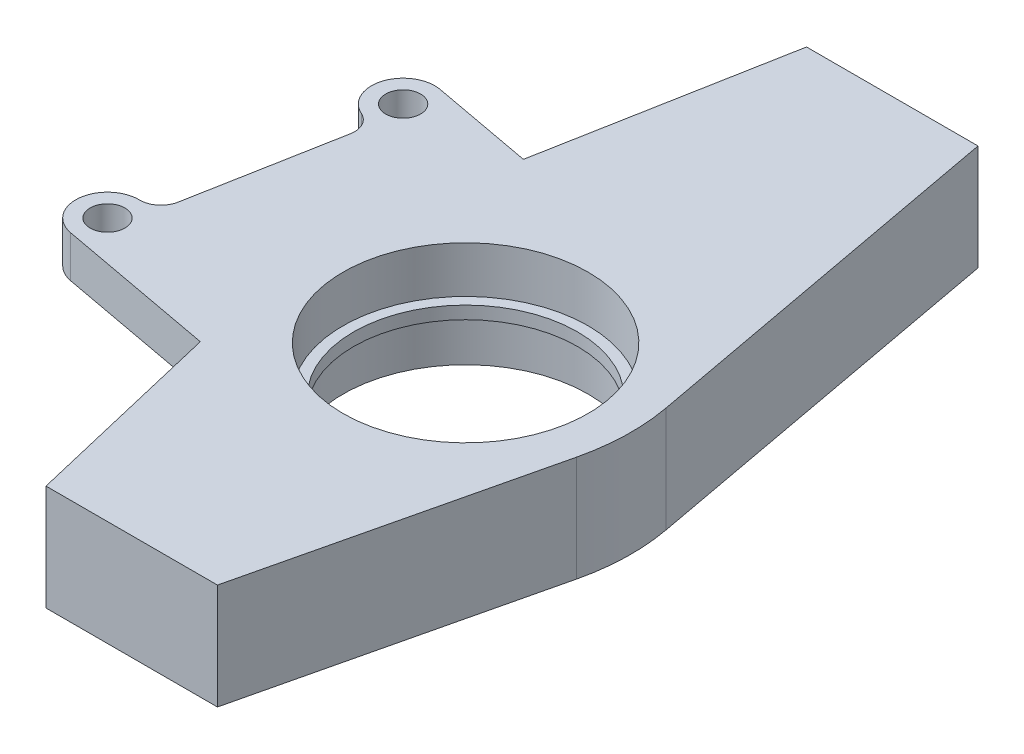
ISO-10303-21;
HEADER;
FILE_DESCRIPTION(('STEP AP214'),'2;1');
FILE_NAME('part.step','',(''),(''),'','','');
FILE_SCHEMA(('AUTOMOTIVE_DESIGN { 1 0 10303 214 1 1 1 1 }'));
ENDSEC;
DATA;
#1=APPLICATION_CONTEXT('core data for automotive mechanical design processes');
#2=APPLICATION_PROTOCOL_DEFINITION('international standard','automotive_design',2000,#1);
#3=PRODUCT_CONTEXT('',#1,'mechanical');
#4=PRODUCT('Part','Part','',(#3));
#5=PRODUCT_RELATED_PRODUCT_CATEGORY('part','',(#4));
#6=PRODUCT_DEFINITION_FORMATION('','',#4);
#7=PRODUCT_DEFINITION_CONTEXT('part definition',#1,'design');
#8=PRODUCT_DEFINITION('design','',#6,#7);
#9=PRODUCT_DEFINITION_SHAPE('','',#8);
#10=(LENGTH_UNIT() NAMED_UNIT(*) SI_UNIT(.MILLI.,.METRE.));
#11=(NAMED_UNIT(*) PLANE_ANGLE_UNIT() SI_UNIT($,.RADIAN.));
#12=(NAMED_UNIT(*) SI_UNIT($,.STERADIAN.) SOLID_ANGLE_UNIT());
#13=UNCERTAINTY_MEASURE_WITH_UNIT(LENGTH_MEASURE(1.E-05),#10,'distance_accuracy_value','');
#14=(GEOMETRIC_REPRESENTATION_CONTEXT(3) GLOBAL_UNCERTAINTY_ASSIGNED_CONTEXT((#13)) GLOBAL_UNIT_ASSIGNED_CONTEXT((#10,
#11,#12)) REPRESENTATION_CONTEXT('',''));
#15=CARTESIAN_POINT('',(0.,0.,0.));
#16=DIRECTION('',(0.,0.,1.));
#17=DIRECTION('',(1.,0.,0.));
#18=AXIS2_PLACEMENT_3D('',#15,#16,#17);
#19=CARTESIAN_POINT('',(0.,25.4,0.));
#20=DIRECTION('',(0.,-1.,0.));
#21=DIRECTION('',(0.,0.,-1.));
#22=AXIS2_PLACEMENT_3D('',#19,#20,#21);
#23=CYLINDRICAL_SURFACE('',#22,29.464);
#24=CARTESIAN_POINT('',(0.,0.,0.));
#25=DIRECTION('',(0.,1.,0.));
#26=DIRECTION('',(0.,0.,1.));
#27=AXIS2_PLACEMENT_3D('',#24,#25,#26);
#28=CIRCLE('',#27,29.464);
#29=CARTESIAN_POINT('',(0.,0.,29.464));
#30=VERTEX_POINT('',#29);
#31=EDGE_CURVE('E249',#30,#30,#28,.T.);
#32=ORIENTED_EDGE('',*,*,#31,.F.);
#33=EDGE_LOOP('',(#32));
#34=FACE_BOUND('',#33,.T.);
#35=CARTESIAN_POINT('',(0.,11.176,0.));
#36=DIRECTION('',(0.,1.,0.));
#37=DIRECTION('',(0.,0.,1.));
#38=AXIS2_PLACEMENT_3D('',#35,#36,#37);
#39=CIRCLE('',#38,29.464);
#40=CARTESIAN_POINT('',(0.,11.176,29.464));
#41=VERTEX_POINT('',#40);
#42=EDGE_CURVE('E189',#41,#41,#39,.T.);
#43=ORIENTED_EDGE('',*,*,#42,.T.);
#44=EDGE_LOOP('',(#43));
#45=FACE_BOUND('',#44,.T.);
#46=ADVANCED_FACE('F47',(#34,#45),#23,.F.);
#47=CARTESIAN_POINT('',(-37.5200137949481,25.4,8.88490807143931));
#48=DIRECTION('',(-0.973088493564171,0.,0.230431733259574));
#49=DIRECTION('',(0.230431733259574,0.,0.973088493564171));
#50=AXIS2_PLACEMENT_3D('',#47,#48,#49);
#51=PLANE('',#50);
#52=DIRECTION('',(-0.230431733259574,0.,-0.973088493564171));
#53=VECTOR('',#52,1.);
#54=CARTESIAN_POINT('',(-37.5200137949481,25.4,8.88490807143931));
#55=LINE('',#54,#53);
#56=CARTESIAN_POINT('',(-20.6134703341005,25.4,80.2794277193094));
#57=VERTEX_POINT('',#56);
#58=CARTESIAN_POINT('',(-32.1274886331244,25.4,31.6569634303029));
#59=VERTEX_POINT('',#58);
#60=EDGE_CURVE('E276',#57,#59,#55,.T.);
#61=ORIENTED_EDGE('',*,*,#60,.T.);
#62=DIRECTION('',(0.,1.,0.));
#63=VECTOR('',#62,1.);
#64=CARTESIAN_POINT('',(-32.1274886331244,15.4,31.6569634303029));
#65=LINE('',#64,#63);
#66=CARTESIAN_POINT('',(-32.1274886331244,15.4,31.6569634303029));
#67=VERTEX_POINT('',#66);
#68=EDGE_CURVE('E71',#67,#59,#65,.T.);
#69=ORIENTED_EDGE('',*,*,#68,.F.);
#70=DIRECTION('',(0.230431733259574,0.,0.973088493564171));
#71=VECTOR('',#70,1.);
#72=CARTESIAN_POINT('',(-37.5200137949481,15.4,8.88490807143931));
#73=LINE('',#72,#71);
#74=CARTESIAN_POINT('',(-39.624,15.4,0.));
#75=VERTEX_POINT('',#74);
#76=EDGE_CURVE('E163',#75,#67,#73,.T.);
#77=ORIENTED_EDGE('',*,*,#76,.F.);
#78=DIRECTION('',(0.,-1.,0.));
#79=VECTOR('',#78,1.);
#80=CARTESIAN_POINT('',(-39.624,25.4,0.));
#81=LINE('',#80,#79);
#82=CARTESIAN_POINT('',(-39.624,0.,0.));
#83=VERTEX_POINT('',#82);
#84=EDGE_CURVE('E333',#75,#83,#81,.T.);
#85=ORIENTED_EDGE('',*,*,#84,.T.);
#86=DIRECTION('',(-0.230431733259574,0.,-0.973088493564171));
#87=VECTOR('',#86,1.);
#88=CARTESIAN_POINT('',(-37.5200137949481,0.,8.88490807143931));
#89=LINE('',#88,#87);
#90=CARTESIAN_POINT('',(-20.6134703341005,0.,80.2794277193094));
#91=VERTEX_POINT('',#90);
#92=EDGE_CURVE('E302',#91,#83,#89,.T.);
#93=ORIENTED_EDGE('',*,*,#92,.F.);
#94=DIRECTION('',(0.,-1.,0.));
#95=VECTOR('',#94,1.);
#96=CARTESIAN_POINT('',(-20.6134703341005,25.4,80.2794277193094));
#97=LINE('',#96,#95);
#98=EDGE_CURVE('E330',#57,#91,#97,.T.);
#99=ORIENTED_EDGE('',*,*,#98,.F.);
#100=EDGE_LOOP('',(#61,#69,#77,#85,#93,#99));
#101=FACE_BOUND('',#100,.T.);
#102=ADVANCED_FACE('F371',(#101),#51,.T.);
#103=CARTESIAN_POINT('',(-38.3088128353339,25.4,-7.09811657657361));
#104=DIRECTION('',(-0.983264114611493,0.,-0.182185841703674));
#105=DIRECTION('',(-0.182185841703674,0.,0.983264114611493));
#106=AXIS2_PLACEMENT_3D('',#103,#104,#105);
#107=PLANE('',#106);
#108=DIRECTION('',(0.,1.,0.));
#109=VECTOR('',#108,1.);
#110=CARTESIAN_POINT('',(-31.2570841137015,15.4,-45.156572344141));
#111=LINE('',#110,#109);
#112=CARTESIAN_POINT('',(-31.2570841137015,15.4,-45.156572344141));
#113=VERTEX_POINT('',#112);
#114=CARTESIAN_POINT('',(-31.2570841137015,25.4,-45.156572344141));
#115=VERTEX_POINT('',#114);
#116=EDGE_CURVE('E263',#113,#115,#111,.T.);
#117=ORIENTED_EDGE('',*,*,#116,.T.);
#118=DIRECTION('',(0.182185841703674,0.,-0.983264114611493));
#119=VECTOR('',#118,1.);
#120=CARTESIAN_POINT('',(-38.3088128353339,25.4,-7.09811657657361));
#121=LINE('',#120,#119);
#122=CARTESIAN_POINT('',(-20.6134703341004,25.4,-102.600572280691));
#123=VERTEX_POINT('',#122);
#124=EDGE_CURVE('E272',#115,#123,#121,.T.);
#125=ORIENTED_EDGE('',*,*,#124,.T.);
#126=DIRECTION('',(0.,-1.,0.));
#127=VECTOR('',#126,1.);
#128=CARTESIAN_POINT('',(-20.6134703341004,25.4,-102.600572280691));
#129=LINE('',#128,#127);
#130=CARTESIAN_POINT('',(-20.6134703341004,0.,-102.600572280691));
#131=VERTEX_POINT('',#130);
#132=EDGE_CURVE('E294',#123,#131,#129,.T.);
#133=ORIENTED_EDGE('',*,*,#132,.T.);
#134=DIRECTION('',(0.182185841703674,0.,-0.983264114611493));
#135=VECTOR('',#134,1.);
#136=CARTESIAN_POINT('',(-38.3088128353339,0.,-7.09811657657361));
#137=LINE('',#136,#135);
#138=EDGE_CURVE('E298',#83,#131,#137,.T.);
#139=ORIENTED_EDGE('',*,*,#138,.F.);
#140=ORIENTED_EDGE('',*,*,#84,.F.);
#141=DIRECTION('',(-0.182185841703674,0.,0.983264114611493));
#142=VECTOR('',#141,1.);
#143=CARTESIAN_POINT('',(-38.3088128353339,15.4,-7.09811657657361));
#144=LINE('',#143,#142);
#145=EDGE_CURVE('E63',#113,#75,#144,.T.);
#146=ORIENTED_EDGE('',*,*,#145,.F.);
#147=EDGE_LOOP('',(#117,#125,#133,#139,#140,#146));
#148=FACE_BOUND('',#147,.T.);
#149=ADVANCED_FACE('F373',(#148),#107,.T.);
#150=CARTESIAN_POINT('',(0.,25.4,80.2794277193094));
#151=DIRECTION('',(0.,0.,-1.));
#152=DIRECTION('',(-1.,0.,0.));
#153=AXIS2_PLACEMENT_3D('',#150,#151,#152);
#154=PLANE('',#153);
#155=DIRECTION('',(1.,0.,0.));
#156=VECTOR('',#155,1.);
#157=CARTESIAN_POINT('',(0.,0.,80.2794277193094));
#158=LINE('',#157,#156);
#159=CARTESIAN_POINT('',(20.6134703341005,0.,80.2794277193094));
#160=VERTEX_POINT('',#159);
#161=EDGE_CURVE('E306',#91,#160,#158,.T.);
#162=ORIENTED_EDGE('',*,*,#161,.T.);
#163=DIRECTION('',(0.,-1.,0.));
#164=VECTOR('',#163,1.);
#165=CARTESIAN_POINT('',(20.6134703341005,25.4,80.2794277193094));
#166=LINE('',#165,#164);
#167=CARTESIAN_POINT('',(20.6134703341005,25.4,80.2794277193094));
#168=VERTEX_POINT('',#167);
#169=EDGE_CURVE('E326',#168,#160,#166,.T.);
#170=ORIENTED_EDGE('',*,*,#169,.F.);
#171=DIRECTION('',(1.,0.,0.));
#172=VECTOR('',#171,1.);
#173=CARTESIAN_POINT('',(0.,25.4,80.2794277193094));
#174=LINE('',#173,#172);
#175=EDGE_CURVE('E279',#57,#168,#174,.T.);
#176=ORIENTED_EDGE('',*,*,#175,.F.);
#177=ORIENTED_EDGE('',*,*,#98,.T.);
#178=EDGE_LOOP('',(#162,#170,#176,#177));
#179=FACE_BOUND('',#178,.T.);
#180=ADVANCED_FACE('F369',(#179),#154,.F.);
#181=CARTESIAN_POINT('',(37.5200137949481,25.4,8.88490807143931));
#182=DIRECTION('',(-0.973088493564171,0.,-0.230431733259574));
#183=DIRECTION('',(-0.230431733259574,0.,0.973088493564171));
#184=AXIS2_PLACEMENT_3D('',#181,#182,#183);
#185=PLANE('',#184);
#186=DIRECTION('',(0.230431733259574,0.,-0.973088493564171));
#187=VECTOR('',#186,1.);
#188=CARTESIAN_POINT('',(37.5200137949481,0.,8.88490807143931));
#189=LINE('',#188,#187);
#190=CARTESIAN_POINT('',(37.1550824465897,0.,10.4259740132052));
#191=VERTEX_POINT('',#190);
#192=EDGE_CURVE('E310',#160,#191,#189,.T.);
#193=ORIENTED_EDGE('',*,*,#192,.T.);
#194=DIRECTION('',(0.,-1.,0.));
#195=VECTOR('',#194,1.);
#196=CARTESIAN_POINT('',(37.1550824465897,25.4,10.4259740132052));
#197=LINE('',#196,#195);
#198=CARTESIAN_POINT('',(37.1550824465897,25.4,10.4259740132052));
#199=VERTEX_POINT('',#198);
#200=EDGE_CURVE('E343',#191,#199,#197,.F.);
#201=ORIENTED_EDGE('',*,*,#200,.T.);
#202=DIRECTION('',(0.230431733259574,0.,-0.973088493564171));
#203=VECTOR('',#202,1.);
#204=CARTESIAN_POINT('',(37.5200137949481,25.4,8.88490807143931));
#205=LINE('',#204,#203);
#206=EDGE_CURVE('E283',#168,#199,#205,.T.);
#207=ORIENTED_EDGE('',*,*,#206,.F.);
#208=ORIENTED_EDGE('',*,*,#169,.T.);
#209=EDGE_LOOP('',(#193,#201,#207,#208));
#210=FACE_BOUND('',#209,.T.);
#211=ADVANCED_FACE('F365',(#210),#185,.F.);
#212=CARTESIAN_POINT('',(38.3088128353339,25.4,-7.09811657657361));
#213=DIRECTION('',(-0.983264114611493,0.,0.182185841703674));
#214=DIRECTION('',(0.182185841703674,0.,0.983264114611493));
#215=AXIS2_PLACEMENT_3D('',#212,#213,#214);
#216=PLANE('',#215);
#217=DIRECTION('',(-0.182185841703674,0.,-0.983264114611493));
#218=VECTOR('',#217,1.);
#219=CARTESIAN_POINT('',(38.3088128353339,25.4,-7.09811657657361));
#220=LINE('',#219,#218);
#221=CARTESIAN_POINT('',(37.6720039957937,25.4,-10.5349987949278));
#222=VERTEX_POINT('',#221);
#223=CARTESIAN_POINT('',(20.6134703341004,25.4,-102.600572280691));
#224=VERTEX_POINT('',#223);
#225=EDGE_CURVE('E287',#222,#224,#220,.T.);
#226=ORIENTED_EDGE('',*,*,#225,.F.);
#227=DIRECTION('',(0.,-1.,0.));
#228=VECTOR('',#227,1.);
#229=CARTESIAN_POINT('',(37.6720039957937,25.4,-10.5349987949278));
#230=LINE('',#229,#228);
#231=CARTESIAN_POINT('',(37.6720039957937,0.,-10.5349987949278));
#232=VERTEX_POINT('',#231);
#233=EDGE_CURVE('E336',#222,#232,#230,.T.);
#234=ORIENTED_EDGE('',*,*,#233,.T.);
#235=DIRECTION('',(-0.182185841703674,0.,-0.983264114611493));
#236=VECTOR('',#235,1.);
#237=CARTESIAN_POINT('',(38.3088128353339,0.,-7.09811657657361));
#238=LINE('',#237,#236);
#239=CARTESIAN_POINT('',(20.6134703341004,0.,-102.600572280691));
#240=VERTEX_POINT('',#239);
#241=EDGE_CURVE('E314',#232,#240,#238,.T.);
#242=ORIENTED_EDGE('',*,*,#241,.T.);
#243=DIRECTION('',(0.,-1.,0.));
#244=VECTOR('',#243,1.);
#245=CARTESIAN_POINT('',(20.6134703341004,25.4,-102.600572280691));
#246=LINE('',#245,#244);
#247=EDGE_CURVE('E322',#224,#240,#246,.T.);
#248=ORIENTED_EDGE('',*,*,#247,.F.);
#249=EDGE_LOOP('',(#226,#234,#242,#248));
#250=FACE_BOUND('',#249,.T.);
#251=ADVANCED_FACE('F358',(#250),#216,.F.);
#252=CARTESIAN_POINT('',(0.,14.224,0.));
#253=DIRECTION('',(0.,1.,0.));
#254=DIRECTION('',(0.,0.,1.));
#255=AXIS2_PLACEMENT_3D('',#252,#253,#254);
#256=CIRCLE('',#255,29.464);
#257=CARTESIAN_POINT('',(0.,14.224,29.464));
#258=VERTEX_POINT('',#257);
#259=EDGE_CURVE('E11',#258,#258,#256,.T.);
#260=ORIENTED_EDGE('',*,*,#259,.F.);
#261=EDGE_LOOP('',(#260));
#262=FACE_BOUND('',#261,.T.);
#263=CARTESIAN_POINT('',(0.,25.4,0.));
#264=DIRECTION('',(0.,1.,0.));
#265=DIRECTION('',(0.,0.,1.));
#266=AXIS2_PLACEMENT_3D('',#263,#264,#265);
#267=CIRCLE('',#266,29.464);
#268=CARTESIAN_POINT('',(0.,25.4,29.464));
#269=VERTEX_POINT('',#268);
#270=EDGE_CURVE('E268',#269,#269,#267,.T.);
#271=ORIENTED_EDGE('',*,*,#270,.T.);
#272=EDGE_LOOP('',(#271));
#273=FACE_BOUND('',#272,.T.);
#274=ADVANCED_FACE('F409',(#262,#273),#23,.F.);
#275=CARTESIAN_POINT('',(0.,25.4,-102.600572280691));
#276=DIRECTION('',(0.,0.,1.));
#277=DIRECTION('',(1.,0.,0.));
#278=AXIS2_PLACEMENT_3D('',#275,#276,#277);
#279=PLANE('',#278);
#280=DIRECTION('',(-1.,0.,0.));
#281=VECTOR('',#280,1.);
#282=CARTESIAN_POINT('',(0.,0.,-102.600572280691));
#283=LINE('',#282,#281);
#284=EDGE_CURVE('E273',#240,#131,#283,.T.);
#285=ORIENTED_EDGE('',*,*,#284,.T.);
#286=ORIENTED_EDGE('',*,*,#132,.F.);
#287=DIRECTION('',(-1.,0.,0.));
#288=VECTOR('',#287,1.);
#289=CARTESIAN_POINT('',(0.,25.4,-102.600572280691));
#290=LINE('',#289,#288);
#291=EDGE_CURVE('E290',#224,#123,#290,.T.);
#292=ORIENTED_EDGE('',*,*,#291,.F.);
#293=ORIENTED_EDGE('',*,*,#247,.T.);
#294=EDGE_LOOP('',(#285,#286,#292,#293));
#295=FACE_BOUND('',#294,.T.);
#296=ADVANCED_FACE('F376',(#295),#279,.F.);
#297=CARTESIAN_POINT('',(0.,25.4,0.));
#298=DIRECTION('',(0.,1.,0.));
#299=DIRECTION('',(0.,0.,1.));
#300=AXIS2_PLACEMENT_3D('',#297,#298,#299);
#301=PLANE('',#300);
#302=ORIENTED_EDGE('',*,*,#124,.F.);
#303=DIRECTION('',(-0.983264114611493,0.,-0.182185841703674));
#304=VECTOR('',#303,1.);
#305=CARTESIAN_POINT('',(7.05172872163238,25.4,-38.0584557675674));
#306=LINE('',#305,#304);
#307=CARTESIAN_POINT('',(-55.8441355497211,25.4,-49.7122279348595));
#308=VERTEX_POINT('',#307);
#309=EDGE_CURVE('E225',#115,#308,#306,.T.);
#310=ORIENTED_EDGE('',*,*,#309,.T.);
#311=CARTESIAN_POINT('',(-57.2323916635031,25.4,-42.2197553815199));
#312=DIRECTION('',(0.,1.,0.));
#313=DIRECTION('',(0.,0.,1.));
#314=AXIS2_PLACEMENT_3D('',#311,#312,#313);
#315=CIRCLE('',#314,7.61999999999999);
#316=CARTESIAN_POINT('',(-60.3220374889098,25.4,-35.2542339600076));
#317=VERTEX_POINT('',#316);
#318=EDGE_CURVE('E229',#317,#308,#315,.F.);
#319=ORIENTED_EDGE('',*,*,#318,.F.);
#320=CARTESIAN_POINT('',(-62.3818013725142,25.4,-30.6105530123327));
#321=DIRECTION('',(0.,1.,0.));
#322=DIRECTION('',(0.,0.,1.));
#323=AXIS2_PLACEMENT_3D('',#320,#321,#322);
#324=CIRCLE('',#323,5.08);
#325=CARTESIAN_POINT('',(-57.3868196702879,25.4,-29.6850489364781));
#326=VERTEX_POINT('',#325);
#327=EDGE_CURVE('E233',#326,#317,#324,.T.);
#328=ORIENTED_EDGE('',*,*,#327,.F.);
#329=DIRECTION('',(-0.182185841703674,0.,0.983264114611493));
#330=VECTOR('',#329,1.);
#331=CARTESIAN_POINT('',(-60.7997393472776,25.4,-11.2653879295945));
#332=LINE('',#331,#330);
#333=CARTESIAN_POINT('',(-63.8680334420889,25.4,5.29431532884738));
#334=VERTEX_POINT('',#333);
#335=EDGE_CURVE('E236',#326,#334,#332,.T.);
#336=ORIENTED_EDGE('',*,*,#335,.T.);
#337=CARTESIAN_POINT('',(-68.8630151443153,25.4,4.36881125299271));
#338=DIRECTION('',(0.,1.,0.));
#339=DIRECTION('',(0.,0.,1.));
#340=AXIS2_PLACEMENT_3D('',#337,#338,#339);
#341=CIRCLE('',#340,5.08000000000001);
#342=CARTESIAN_POINT('',(-68.9344793649958,25.4,9.44830855736865));
#343=VERTEX_POINT('',#342);
#344=EDGE_CURVE('E240',#334,#343,#341,.F.);
#345=ORIENTED_EDGE('',*,*,#344,.T.);
#346=CARTESIAN_POINT('',(-69.0416756960167,25.4,17.0675545139326));
#347=DIRECTION('',(0.,1.,0.));
#348=DIRECTION('',(0.,0.,1.));
#349=AXIS2_PLACEMENT_3D('',#346,#347,#348);
#350=CIRCLE('',#349,7.62);
#351=CARTESIAN_POINT('',(-70.4299318097987,25.4,24.5600270672722));
#352=VERTEX_POINT('',#351);
#353=EDGE_CURVE('E220',#352,#343,#350,.F.);
#354=ORIENTED_EDGE('',*,*,#353,.F.);
#355=DIRECTION('',(-0.983264114611493,0.,-0.182185841703674));
#356=VECTOR('',#355,1.);
#357=CARTESIAN_POINT('',(-6.7372924886902,25.4,36.3614311179321));
#358=LINE('',#357,#356);
#359=EDGE_CURVE('E171',#59,#352,#358,.T.);
#360=ORIENTED_EDGE('',*,*,#359,.F.);
#361=ORIENTED_EDGE('',*,*,#60,.F.);
#362=ORIENTED_EDGE('',*,*,#175,.T.);
#363=ORIENTED_EDGE('',*,*,#206,.T.);
#364=CARTESIAN_POINT('',(-12.2778130264702,25.4,-1.27995803638118));
#365=DIRECTION('',(0.,1.,0.));
#366=DIRECTION('',(0.,0.,1.));
#367=AXIS2_PLACEMENT_3D('',#364,#365,#366);
#368=CIRCLE('',#367,50.8);
#369=EDGE_CURVE('E56',#199,#222,#368,.T.);
#370=ORIENTED_EDGE('',*,*,#369,.T.);
#371=ORIENTED_EDGE('',*,*,#225,.T.);
#372=ORIENTED_EDGE('',*,*,#291,.T.);
#373=EDGE_LOOP('',(#302,#310,#319,#328,#336,#345,#354,#360,#361,#362,#363,#370,#371,#372));
#374=FACE_BOUND('',#373,.T.);
#375=ORIENTED_EDGE('',*,*,#270,.F.);
#376=EDGE_LOOP('',(#375));
#377=FACE_BOUND('',#376,.T.);
#378=CARTESIAN_POINT('',(-69.0416756960167,25.4,17.0675545139326));
#379=DIRECTION('',(0.,1.,0.));
#380=DIRECTION('',(0.,0.,1.));
#381=AXIS2_PLACEMENT_3D('',#378,#379,#380);
#382=CIRCLE('',#381,4.191);
#383=CARTESIAN_POINT('',(-69.0416756960167,25.4,21.2585545139326));
#384=VERTEX_POINT('',#383);
#385=EDGE_CURVE('E186',#384,#384,#382,.F.);
#386=ORIENTED_EDGE('',*,*,#385,.T.);
#387=EDGE_LOOP('',(#386));
#388=FACE_BOUND('',#387,.T.);
#389=CARTESIAN_POINT('',(-57.2323916635031,25.4,-42.2197553815199));
#390=DIRECTION('',(0.,1.,0.));
#391=DIRECTION('',(0.,0.,1.));
#392=AXIS2_PLACEMENT_3D('',#389,#390,#391);
#393=CIRCLE('',#392,4.191);
#394=CARTESIAN_POINT('',(-57.2323916635031,25.4,-38.0287553815199));
#395=VERTEX_POINT('',#394);
#396=EDGE_CURVE('E182',#395,#395,#393,.F.);
#397=ORIENTED_EDGE('',*,*,#396,.T.);
#398=EDGE_LOOP('',(#397));
#399=FACE_BOUND('',#398,.T.);
#400=ADVANCED_FACE('F350',(#374,#377,#388,#399),#301,.T.);
#401=CARTESIAN_POINT('',(0.,0.,0.));
#402=DIRECTION('',(0.,1.,0.));
#403=DIRECTION('',(0.,0.,1.));
#404=AXIS2_PLACEMENT_3D('',#401,#402,#403);
#405=PLANE('',#404);
#406=ORIENTED_EDGE('',*,*,#31,.T.);
#407=EDGE_LOOP('',(#406));
#408=FACE_BOUND('',#407,.T.);
#409=ORIENTED_EDGE('',*,*,#241,.F.);
#410=CARTESIAN_POINT('',(-12.2778130264702,0.,-1.27995803638118));
#411=DIRECTION('',(0.,1.,0.));
#412=DIRECTION('',(0.,0.,1.));
#413=AXIS2_PLACEMENT_3D('',#410,#411,#412);
#414=CIRCLE('',#413,50.8);
#415=EDGE_CURVE('E340',#232,#191,#414,.F.);
#416=ORIENTED_EDGE('',*,*,#415,.T.);
#417=ORIENTED_EDGE('',*,*,#192,.F.);
#418=ORIENTED_EDGE('',*,*,#161,.F.);
#419=ORIENTED_EDGE('',*,*,#92,.T.);
#420=ORIENTED_EDGE('',*,*,#138,.T.);
#421=ORIENTED_EDGE('',*,*,#284,.F.);
#422=EDGE_LOOP('',(#409,#416,#417,#418,#419,#420,#421));
#423=FACE_BOUND('',#422,.T.);
#424=ADVANCED_FACE('F361',(#408,#423),#405,.F.);
#425=CARTESIAN_POINT('',(-12.2778130264702,25.4,-1.27995803638118));
#426=DIRECTION('',(0.,-1.,0.));
#427=DIRECTION('',(0.,0.,-1.));
#428=AXIS2_PLACEMENT_3D('',#425,#426,#427);
#429=CYLINDRICAL_SURFACE('',#428,50.8);
#430=ORIENTED_EDGE('',*,*,#369,.F.);
#431=ORIENTED_EDGE('',*,*,#200,.F.);
#432=ORIENTED_EDGE('',*,*,#415,.F.);
#433=ORIENTED_EDGE('',*,*,#233,.F.);
#434=EDGE_LOOP('',(#430,#431,#432,#433));
#435=FACE_BOUND('',#434,.T.);
#436=ADVANCED_FACE('F49',(#435),#429,.T.);
#437=CARTESIAN_POINT('',(-69.0416756960167,15.4,17.0675545139326));
#438=DIRECTION('',(0.,1.,0.));
#439=DIRECTION('',(0.,0.,1.));
#440=AXIS2_PLACEMENT_3D('',#437,#438,#439);
#441=CYLINDRICAL_SURFACE('',#440,7.62);
#442=ORIENTED_EDGE('',*,*,#353,.T.);
#443=DIRECTION('',(0.,1.,0.));
#444=VECTOR('',#443,1.);
#445=CARTESIAN_POINT('',(-68.9344793649958,15.4,9.44830855736865));
#446=LINE('',#445,#444);
#447=CARTESIAN_POINT('',(-68.9344793649958,15.4,9.44830855736865));
#448=VERTEX_POINT('',#447);
#449=EDGE_CURVE('E179',#448,#343,#446,.T.);
#450=ORIENTED_EDGE('',*,*,#449,.F.);
#451=CARTESIAN_POINT('',(-69.0416756960167,15.4,17.0675545139326));
#452=DIRECTION('',(0.,1.,0.));
#453=DIRECTION('',(0.,0.,1.));
#454=AXIS2_PLACEMENT_3D('',#451,#452,#453);
#455=CIRCLE('',#454,7.62);
#456=CARTESIAN_POINT('',(-70.4299318097987,15.4,24.5600270672722));
#457=VERTEX_POINT('',#456);
#458=EDGE_CURVE('E161',#457,#448,#455,.F.);
#459=ORIENTED_EDGE('',*,*,#458,.F.);
#460=DIRECTION('',(0.,1.,0.));
#461=VECTOR('',#460,1.);
#462=CARTESIAN_POINT('',(-70.4299318097987,15.4,24.5600270672722));
#463=LINE('',#462,#461);
#464=EDGE_CURVE('E168',#457,#352,#463,.T.);
#465=ORIENTED_EDGE('',*,*,#464,.T.);
#466=EDGE_LOOP('',(#442,#450,#459,#465));
#467=FACE_BOUND('',#466,.T.);
#468=ADVANCED_FACE('F178',(#467),#441,.T.);
#469=CARTESIAN_POINT('',(-68.8630151443153,15.4,4.36881125299271));
#470=DIRECTION('',(0.,1.,0.));
#471=DIRECTION('',(0.,0.,1.));
#472=AXIS2_PLACEMENT_3D('',#469,#470,#471);
#473=CYLINDRICAL_SURFACE('',#472,5.08000000000001);
#474=ORIENTED_EDGE('',*,*,#344,.F.);
#475=DIRECTION('',(0.,1.,0.));
#476=VECTOR('',#475,1.);
#477=CARTESIAN_POINT('',(-63.8680334420889,15.4,5.29431532884738));
#478=LINE('',#477,#476);
#479=CARTESIAN_POINT('',(-63.8680334420889,15.4,5.29431532884738));
#480=VERTEX_POINT('',#479);
#481=EDGE_CURVE('E250',#480,#334,#478,.T.);
#482=ORIENTED_EDGE('',*,*,#481,.F.);
#483=CARTESIAN_POINT('',(-68.8630151443153,15.4,4.36881125299271));
#484=DIRECTION('',(0.,1.,0.));
#485=DIRECTION('',(0.,0.,1.));
#486=AXIS2_PLACEMENT_3D('',#483,#484,#485);
#487=CIRCLE('',#486,5.08000000000001);
#488=EDGE_CURVE('E210',#480,#448,#487,.F.);
#489=ORIENTED_EDGE('',*,*,#488,.T.);
#490=ORIENTED_EDGE('',*,*,#449,.T.);
#491=EDGE_LOOP('',(#474,#482,#489,#490));
#492=FACE_BOUND('',#491,.T.);
#493=ADVANCED_FACE('F396',(#492),#473,.F.);
#494=CARTESIAN_POINT('',(-60.7997393472776,15.4,-11.2653879295945));
#495=DIRECTION('',(-0.983264114611493,0.,-0.182185841703674));
#496=DIRECTION('',(-0.182185841703674,0.,0.983264114611493));
#497=AXIS2_PLACEMENT_3D('',#494,#495,#496);
#498=PLANE('',#497);
#499=ORIENTED_EDGE('',*,*,#335,.F.);
#500=DIRECTION('',(0.,1.,0.));
#501=VECTOR('',#500,1.);
#502=CARTESIAN_POINT('',(-57.3868196702879,15.4,-29.6850489364781));
#503=LINE('',#502,#501);
#504=CARTESIAN_POINT('',(-57.3868196702879,15.4,-29.6850489364781));
#505=VERTEX_POINT('',#504);
#506=EDGE_CURVE('E253',#505,#326,#503,.T.);
#507=ORIENTED_EDGE('',*,*,#506,.F.);
#508=DIRECTION('',(-0.182185841703674,0.,0.983264114611493));
#509=VECTOR('',#508,1.);
#510=CARTESIAN_POINT('',(-60.7997393472776,15.4,-11.2653879295945));
#511=LINE('',#510,#509);
#512=EDGE_CURVE('E206',#505,#480,#511,.T.);
#513=ORIENTED_EDGE('',*,*,#512,.T.);
#514=ORIENTED_EDGE('',*,*,#481,.T.);
#515=EDGE_LOOP('',(#499,#507,#513,#514));
#516=FACE_BOUND('',#515,.T.);
#517=ADVANCED_FACE('F392',(#516),#498,.T.);
#518=CARTESIAN_POINT('',(-62.3818013725142,15.4,-30.6105530123327));
#519=DIRECTION('',(0.,1.,0.));
#520=DIRECTION('',(0.,0.,1.));
#521=AXIS2_PLACEMENT_3D('',#518,#519,#520);
#522=CYLINDRICAL_SURFACE('',#521,5.08);
#523=ORIENTED_EDGE('',*,*,#327,.T.);
#524=DIRECTION('',(0.,1.,0.));
#525=VECTOR('',#524,1.);
#526=CARTESIAN_POINT('',(-60.3220374889098,15.4,-35.2542339600076));
#527=LINE('',#526,#525);
#528=CARTESIAN_POINT('',(-60.3220374889098,15.4,-35.2542339600076));
#529=VERTEX_POINT('',#528);
#530=EDGE_CURVE('E256',#529,#317,#527,.T.);
#531=ORIENTED_EDGE('',*,*,#530,.F.);
#532=CARTESIAN_POINT('',(-62.3818013725142,15.4,-30.6105530123327));
#533=DIRECTION('',(0.,1.,0.));
#534=DIRECTION('',(0.,0.,1.));
#535=AXIS2_PLACEMENT_3D('',#532,#533,#534);
#536=CIRCLE('',#535,5.08);
#537=EDGE_CURVE('E203',#505,#529,#536,.T.);
#538=ORIENTED_EDGE('',*,*,#537,.F.);
#539=ORIENTED_EDGE('',*,*,#506,.T.);
#540=EDGE_LOOP('',(#523,#531,#538,#539));
#541=FACE_BOUND('',#540,.T.);
#542=ADVANCED_FACE('F398',(#541),#522,.F.);
#543=CARTESIAN_POINT('',(-57.2323916635031,15.4,-42.2197553815199));
#544=DIRECTION('',(0.,1.,0.));
#545=DIRECTION('',(0.,0.,1.));
#546=AXIS2_PLACEMENT_3D('',#543,#544,#545);
#547=CYLINDRICAL_SURFACE('',#546,7.61999999999999);
#548=ORIENTED_EDGE('',*,*,#318,.T.);
#549=DIRECTION('',(0.,1.,0.));
#550=VECTOR('',#549,1.);
#551=CARTESIAN_POINT('',(-55.8441355497211,15.4,-49.7122279348595));
#552=LINE('',#551,#550);
#553=CARTESIAN_POINT('',(-55.8441355497211,15.4,-49.7122279348595));
#554=VERTEX_POINT('',#553);
#555=EDGE_CURVE('E260',#554,#308,#552,.T.);
#556=ORIENTED_EDGE('',*,*,#555,.F.);
#557=CARTESIAN_POINT('',(-57.2323916635031,15.4,-42.2197553815199));
#558=DIRECTION('',(0.,1.,0.));
#559=DIRECTION('',(0.,0.,1.));
#560=AXIS2_PLACEMENT_3D('',#557,#558,#559);
#561=CIRCLE('',#560,7.61999999999999);
#562=EDGE_CURVE('E200',#529,#554,#561,.F.);
#563=ORIENTED_EDGE('',*,*,#562,.F.);
#564=ORIENTED_EDGE('',*,*,#530,.T.);
#565=EDGE_LOOP('',(#548,#556,#563,#564));
#566=FACE_BOUND('',#565,.T.);
#567=ADVANCED_FACE('F385',(#566),#547,.T.);
#568=CARTESIAN_POINT('',(7.05172872163238,15.4,-38.0584557675674));
#569=DIRECTION('',(0.182185841703674,0.,-0.983264114611493));
#570=DIRECTION('',(-0.983264114611493,0.,-0.182185841703674));
#571=AXIS2_PLACEMENT_3D('',#568,#569,#570);
#572=PLANE('',#571);
#573=ORIENTED_EDGE('',*,*,#309,.F.);
#574=ORIENTED_EDGE('',*,*,#116,.F.);
#575=DIRECTION('',(-0.983264114611493,0.,-0.182185841703674));
#576=VECTOR('',#575,1.);
#577=CARTESIAN_POINT('',(7.05172872163238,15.4,-38.0584557675674));
#578=LINE('',#577,#576);
#579=EDGE_CURVE('E196',#113,#554,#578,.T.);
#580=ORIENTED_EDGE('',*,*,#579,.T.);
#581=ORIENTED_EDGE('',*,*,#555,.T.);
#582=EDGE_LOOP('',(#573,#574,#580,#581));
#583=FACE_BOUND('',#582,.T.);
#584=ADVANCED_FACE('F380',(#583),#572,.T.);
#585=CARTESIAN_POINT('',(-69.0416756960167,15.4,17.0675545139326));
#586=DIRECTION('',(0.,1.,0.));
#587=DIRECTION('',(0.,0.,1.));
#588=AXIS2_PLACEMENT_3D('',#585,#586,#587);
#589=CYLINDRICAL_SURFACE('',#588,4.191);
#590=CARTESIAN_POINT('',(-69.0416756960167,15.4,17.0675545139326));
#591=DIRECTION('',(0.,1.,0.));
#592=DIRECTION('',(0.,0.,1.));
#593=AXIS2_PLACEMENT_3D('',#590,#591,#592);
#594=CIRCLE('',#593,4.191);
#595=CARTESIAN_POINT('',(-69.0416756960167,15.4,21.2585545139326));
#596=VERTEX_POINT('',#595);
#597=EDGE_CURVE('E213',#596,#596,#594,.F.);
#598=ORIENTED_EDGE('',*,*,#597,.T.);
#599=EDGE_LOOP('',(#598));
#600=FACE_BOUND('',#599,.T.);
#601=ORIENTED_EDGE('',*,*,#385,.F.);
#602=EDGE_LOOP('',(#601));
#603=FACE_BOUND('',#602,.T.);
#604=ADVANCED_FACE('F445',(#600,#603),#589,.F.);
#605=CARTESIAN_POINT('',(-6.7372924886902,15.4,36.3614311179321));
#606=DIRECTION('',(0.182185841703674,0.,-0.983264114611493));
#607=DIRECTION('',(-0.983264114611493,0.,-0.182185841703674));
#608=AXIS2_PLACEMENT_3D('',#605,#606,#607);
#609=PLANE('',#608);
#610=ORIENTED_EDGE('',*,*,#359,.T.);
#611=ORIENTED_EDGE('',*,*,#464,.F.);
#612=DIRECTION('',(-0.983264114611493,0.,-0.182185841703674));
#613=VECTOR('',#612,1.);
#614=CARTESIAN_POINT('',(-6.7372924886902,15.4,36.3614311179321));
#615=LINE('',#614,#613);
#616=EDGE_CURVE('E155',#67,#457,#615,.T.);
#617=ORIENTED_EDGE('',*,*,#616,.F.);
#618=ORIENTED_EDGE('',*,*,#68,.T.);
#619=EDGE_LOOP('',(#610,#611,#617,#618));
#620=FACE_BOUND('',#619,.T.);
#621=ADVANCED_FACE('F169',(#620),#609,.F.);
#622=CARTESIAN_POINT('',(-57.2323916635031,15.4,-42.2197553815199));
#623=DIRECTION('',(0.,1.,0.));
#624=DIRECTION('',(0.,0.,1.));
#625=AXIS2_PLACEMENT_3D('',#622,#623,#624);
#626=CYLINDRICAL_SURFACE('',#625,4.191);
#627=CARTESIAN_POINT('',(-57.2323916635031,15.4,-42.2197553815199));
#628=DIRECTION('',(0.,1.,0.));
#629=DIRECTION('',(0.,0.,1.));
#630=AXIS2_PLACEMENT_3D('',#627,#628,#629);
#631=CIRCLE('',#630,4.191);
#632=CARTESIAN_POINT('',(-57.2323916635031,15.4,-38.0287553815199));
#633=VERTEX_POINT('',#632);
#634=EDGE_CURVE('E176',#633,#633,#631,.F.);
#635=ORIENTED_EDGE('',*,*,#634,.T.);
#636=EDGE_LOOP('',(#635));
#637=FACE_BOUND('',#636,.T.);
#638=ORIENTED_EDGE('',*,*,#396,.F.);
#639=EDGE_LOOP('',(#638));
#640=FACE_BOUND('',#639,.T.);
#641=ADVANCED_FACE('F435',(#637,#640),#626,.F.);
#642=CARTESIAN_POINT('',(0.,15.4,0.));
#643=DIRECTION('',(0.,1.,0.));
#644=DIRECTION('',(0.,0.,1.));
#645=AXIS2_PLACEMENT_3D('',#642,#643,#644);
#646=PLANE('',#645);
#647=ORIENTED_EDGE('',*,*,#458,.T.);
#648=ORIENTED_EDGE('',*,*,#488,.F.);
#649=ORIENTED_EDGE('',*,*,#512,.F.);
#650=ORIENTED_EDGE('',*,*,#537,.T.);
#651=ORIENTED_EDGE('',*,*,#562,.T.);
#652=ORIENTED_EDGE('',*,*,#579,.F.);
#653=ORIENTED_EDGE('',*,*,#145,.T.);
#654=ORIENTED_EDGE('',*,*,#76,.T.);
#655=ORIENTED_EDGE('',*,*,#616,.T.);
#656=EDGE_LOOP('',(#647,#648,#649,#650,#651,#652,#653,#654,#655));
#657=FACE_BOUND('',#656,.T.);
#658=ORIENTED_EDGE('',*,*,#597,.F.);
#659=EDGE_LOOP('',(#658));
#660=FACE_BOUND('',#659,.T.);
#661=ORIENTED_EDGE('',*,*,#634,.F.);
#662=EDGE_LOOP('',(#661));
#663=FACE_BOUND('',#662,.T.);
#664=ADVANCED_FACE('F157',(#657,#660,#663),#646,.F.);
#665=CARTESIAN_POINT('',(0.,11.176,0.));
#666=DIRECTION('',(0.,1.,0.));
#667=DIRECTION('',(0.,0.,1.));
#668=AXIS2_PLACEMENT_3D('',#665,#666,#667);
#669=PLANE('',#668);
#670=CARTESIAN_POINT('',(0.,11.176,0.));
#671=DIRECTION('',(0.,1.,0.));
#672=DIRECTION('',(0.,0.,1.));
#673=AXIS2_PLACEMENT_3D('',#670,#671,#672);
#674=CIRCLE('',#673,26.924);
#675=CARTESIAN_POINT('',(0.,11.176,26.924));
#676=VERTEX_POINT('',#675);
#677=EDGE_CURVE('E699',#676,#676,#674,.T.);
#678=ORIENTED_EDGE('',*,*,#677,.T.);
#679=EDGE_LOOP('',(#678));
#680=FACE_BOUND('',#679,.T.);
#681=ORIENTED_EDGE('',*,*,#42,.F.);
#682=EDGE_LOOP('',(#681));
#683=FACE_BOUND('',#682,.T.);
#684=ADVANCED_FACE('F443',(#680,#683),#669,.F.);
#685=CARTESIAN_POINT('',(0.,11.176,0.));
#686=DIRECTION('',(0.,1.,0.));
#687=DIRECTION('',(0.,0.,1.));
#688=AXIS2_PLACEMENT_3D('',#685,#686,#687);
#689=CYLINDRICAL_SURFACE('',#688,26.924);
#690=CARTESIAN_POINT('',(0.,14.224,0.));
#691=DIRECTION('',(0.,1.,0.));
#692=DIRECTION('',(0.,0.,1.));
#693=AXIS2_PLACEMENT_3D('',#690,#691,#692);
#694=CIRCLE('',#693,26.924);
#695=CARTESIAN_POINT('',(0.,14.224,26.924));
#696=VERTEX_POINT('',#695);
#697=EDGE_CURVE('E696',#696,#696,#694,.T.);
#698=CARTESIAN_POINT('',(0.,11.176,26.924));
#699=CARTESIAN_POINT('',(0.,11.20775,26.924));
#700=CARTESIAN_POINT('',(0.,11.2395,26.924));
#701=CARTESIAN_POINT('',(0.,11.303,26.924));
#702=CARTESIAN_POINT('',(0.,11.33475,26.924));
#703=CARTESIAN_POINT('',(0.,11.39825,26.924));
#704=CARTESIAN_POINT('',(0.,11.43,26.924));
#705=CARTESIAN_POINT('',(0.,11.4935,26.924));
#706=CARTESIAN_POINT('',(0.,11.52525,26.924));
#707=CARTESIAN_POINT('',(0.,11.58875,26.924));
#708=CARTESIAN_POINT('',(0.,11.6205,26.924));
#709=CARTESIAN_POINT('',(0.,11.684,26.924));
#710=CARTESIAN_POINT('',(0.,11.71575,26.924));
#711=CARTESIAN_POINT('',(0.,11.77925,26.924));
#712=CARTESIAN_POINT('',(0.,11.811,26.924));
#713=CARTESIAN_POINT('',(0.,11.8745,26.924));
#714=CARTESIAN_POINT('',(0.,11.90625,26.924));
#715=CARTESIAN_POINT('',(0.,11.96975,26.924));
#716=CARTESIAN_POINT('',(0.,12.0015,26.924));
#717=CARTESIAN_POINT('',(0.,12.065,26.924));
#718=CARTESIAN_POINT('',(0.,12.09675,26.924));
#719=CARTESIAN_POINT('',(0.,12.16025,26.924));
#720=CARTESIAN_POINT('',(0.,12.192,26.924));
#721=CARTESIAN_POINT('',(0.,12.2555,26.924));
#722=CARTESIAN_POINT('',(0.,12.28725,26.924));
#723=CARTESIAN_POINT('',(0.,12.35075,26.924));
#724=CARTESIAN_POINT('',(0.,12.3825,26.924));
#725=CARTESIAN_POINT('',(0.,12.446,26.924));
#726=CARTESIAN_POINT('',(0.,12.47775,26.924));
#727=CARTESIAN_POINT('',(0.,12.54125,26.924));
#728=CARTESIAN_POINT('',(0.,12.573,26.924));
#729=CARTESIAN_POINT('',(0.,12.6365,26.924));
#730=CARTESIAN_POINT('',(0.,12.66825,26.924));
#731=CARTESIAN_POINT('',(0.,12.73175,26.924));
#732=CARTESIAN_POINT('',(0.,12.7635,26.924));
#733=CARTESIAN_POINT('',(0.,12.827,26.924));
#734=CARTESIAN_POINT('',(0.,12.85875,26.924));
#735=CARTESIAN_POINT('',(0.,12.92225,26.924));
#736=CARTESIAN_POINT('',(0.,12.954,26.924));
#737=CARTESIAN_POINT('',(0.,13.0175,26.924));
#738=CARTESIAN_POINT('',(0.,13.04925,26.924));
#739=CARTESIAN_POINT('',(0.,13.11275,26.924));
#740=CARTESIAN_POINT('',(0.,13.1445,26.924));
#741=CARTESIAN_POINT('',(0.,13.208,26.924));
#742=CARTESIAN_POINT('',(0.,13.23975,26.924));
#743=CARTESIAN_POINT('',(0.,13.30325,26.924));
#744=CARTESIAN_POINT('',(0.,13.335,26.924));
#745=CARTESIAN_POINT('',(0.,13.3985,26.924));
#746=CARTESIAN_POINT('',(0.,13.43025,26.924));
#747=CARTESIAN_POINT('',(0.,13.49375,26.924));
#748=CARTESIAN_POINT('',(0.,13.5255,26.924));
#749=CARTESIAN_POINT('',(0.,13.589,26.924));
#750=CARTESIAN_POINT('',(0.,13.62075,26.924));
#751=CARTESIAN_POINT('',(0.,13.68425,26.924));
#752=CARTESIAN_POINT('',(0.,13.716,26.924));
#753=CARTESIAN_POINT('',(0.,13.7795,26.924));
#754=CARTESIAN_POINT('',(0.,13.81125,26.924));
#755=CARTESIAN_POINT('',(0.,13.87475,26.924));
#756=CARTESIAN_POINT('',(0.,13.9065,26.924));
#757=CARTESIAN_POINT('',(0.,13.97,26.924));
#758=CARTESIAN_POINT('',(0.,14.00175,26.924));
#759=CARTESIAN_POINT('',(0.,14.06525,26.924));
#760=CARTESIAN_POINT('',(0.,14.097,26.924));
#761=CARTESIAN_POINT('',(0.,14.1605,26.924));
#762=CARTESIAN_POINT('',(0.,14.19225,26.924));
#763=CARTESIAN_POINT('',(0.,14.224,26.924));
#764=B_SPLINE_CURVE_WITH_KNOTS('',3,(#698,#699,#700,#701,#702,#703,#704,#705,#706,#707,#708,
#709,#710,#711,#712,#713,#714,#715,#716,#717,#718,#719,#720,#721,#722,#723,#724,#725,#726,#727,
#728,#729,#730,#731,#732,#733,#734,#735,#736,#737,#738,#739,#740,#741,#742,#743,#744,#745,#746,
#747,#748,#749,#750,#751,#752,#753,#754,#755,#756,#757,#758,#759,#760,#761,#762,#763),
.UNSPECIFIED.,.F.,.F.,(4,2,2,2,2,2,2,2,2,2,2,2,2,2,2,2,2,2,2,2,2,2,2,2,2,2,2,2,2,2,2,2,4),(0.,
0.0952500000000016,0.190500000000001,0.285750000000001,0.381000000000001,0.476250000000001,
0.571500000000001,0.666750000000001,0.762000000000001,0.85725,0.9525,1.04775,1.143,1.23825,
1.3335,1.42875,1.524,1.61925,1.7145,1.80975,1.905,2.00025,2.0955,2.19075,2.286,2.38125,2.4765,
2.57175,2.667,2.76225,2.8575,2.95275,3.048),.UNSPECIFIED.);
#765=EDGE_CURVE('BSEAM585',#676,#696,#764,.T.);
#766=ORIENTED_EDGE('',*,*,#677,.F.);
#767=ORIENTED_EDGE('',*,*,#697,.T.);
#768=ORIENTED_EDGE('',*,*,#765,.T.);
#769=ORIENTED_EDGE('',*,*,#765,.F.);
#770=EDGE_LOOP('',(#766,#768,#767,#769));
#771=FACE_BOUND('',#770,.T.);
#772=ADVANCED_FACE('F585',(#771),#689,.F.);
#773=CARTESIAN_POINT('',(0.,14.224,0.));
#774=DIRECTION('',(0.,1.,0.));
#775=DIRECTION('',(0.,0.,1.));
#776=AXIS2_PLACEMENT_3D('',#773,#774,#775);
#777=PLANE('',#776);
#778=ORIENTED_EDGE('',*,*,#259,.T.);
#779=EDGE_LOOP('',(#778));
#780=FACE_BOUND('',#779,.T.);
#781=ORIENTED_EDGE('',*,*,#697,.F.);
#782=EDGE_LOOP('',(#781));
#783=FACE_BOUND('',#782,.T.);
#784=ADVANCED_FACE('F594',(#780,#783),#777,.T.);
#785=CLOSED_SHELL('',(#46,#102,#149,#180,#211,#251,#274,#296,#400,#424,#436,#468,#493,#517,#542,
#567,#584,#604,#621,#641,#664,#684,#772,#784));
#786=MANIFOLD_SOLID_BREP('B2',#785);
#787=ADVANCED_BREP_SHAPE_REPRESENTATION('',(#18,#786),#14);
#788=SHAPE_DEFINITION_REPRESENTATION(#9,#787);
ENDSEC;
END-ISO-10303-21;
